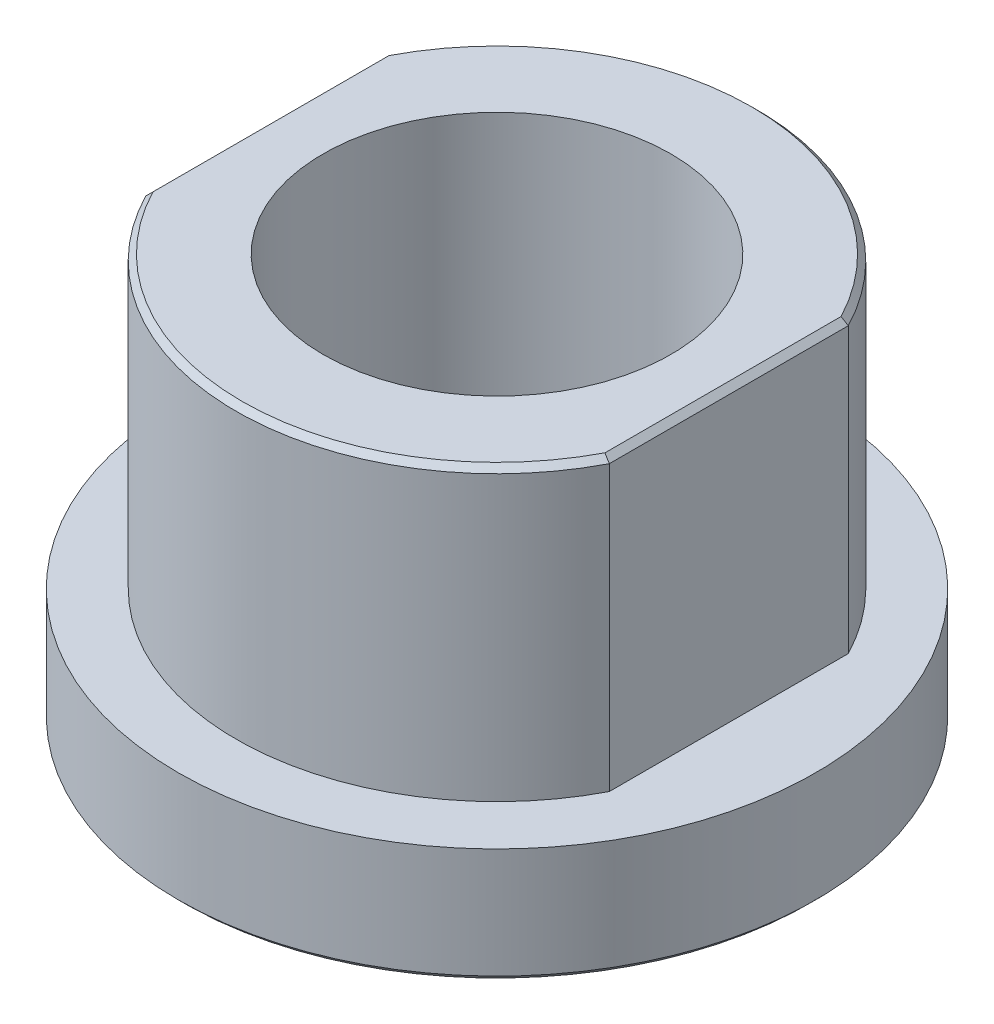
ISO-10303-21;
HEADER;
FILE_DESCRIPTION(('STEP AP214'),'2;1');
FILE_NAME('part.step','',(''),(''),'','','');
FILE_SCHEMA(('AUTOMOTIVE_DESIGN { 1 0 10303 214 1 1 1 1 }'));
ENDSEC;
DATA;
#1=APPLICATION_CONTEXT('core data for automotive mechanical design processes');
#2=APPLICATION_PROTOCOL_DEFINITION('international standard','automotive_design',2000,#1);
#3=PRODUCT_CONTEXT('',#1,'mechanical');
#4=PRODUCT('Part','Part','',(#3));
#5=PRODUCT_RELATED_PRODUCT_CATEGORY('part','',(#4));
#6=PRODUCT_DEFINITION_FORMATION('','',#4);
#7=PRODUCT_DEFINITION_CONTEXT('part definition',#1,'design');
#8=PRODUCT_DEFINITION('design','',#6,#7);
#9=PRODUCT_DEFINITION_SHAPE('','',#8);
#10=(LENGTH_UNIT() NAMED_UNIT(*) SI_UNIT(.MILLI.,.METRE.));
#11=(NAMED_UNIT(*) PLANE_ANGLE_UNIT() SI_UNIT($,.RADIAN.));
#12=(NAMED_UNIT(*) SI_UNIT($,.STERADIAN.) SOLID_ANGLE_UNIT());
#13=UNCERTAINTY_MEASURE_WITH_UNIT(LENGTH_MEASURE(1.E-05),#10,'distance_accuracy_value','');
#14=(GEOMETRIC_REPRESENTATION_CONTEXT(3) GLOBAL_UNCERTAINTY_ASSIGNED_CONTEXT((#13)) GLOBAL_UNIT_ASSIGNED_CONTEXT((#10,
#11,#12)) REPRESENTATION_CONTEXT('',''));
#15=CARTESIAN_POINT('',(0.,0.,0.));
#16=DIRECTION('',(0.,0.,1.));
#17=DIRECTION('',(1.,0.,0.));
#18=AXIS2_PLACEMENT_3D('',#15,#16,#17);
#19=CARTESIAN_POINT('',(0.,0.,0.));
#20=DIRECTION('',(0.,-1.,0.));
#21=DIRECTION('',(0.,0.,-1.));
#22=AXIS2_PLACEMENT_3D('',#19,#20,#21);
#23=CYLINDRICAL_SURFACE('',#22,4.5);
#24=DIRECTION('',(0.,1.,0.));
#25=VECTOR('',#24,1.);
#26=CARTESIAN_POINT('',(4.,-2.15331193145903,2.06155281280883));
#27=LINE('',#26,#25);
#28=CARTESIAN_POINT('',(4.,2.,2.06155281280883));
#29=VERTEX_POINT('',#28);
#30=CARTESIAN_POINT('',(4.,6.9,2.06155281280883));
#31=VERTEX_POINT('',#30);
#32=EDGE_CURVE('E276',#29,#31,#27,.T.);
#33=ORIENTED_EDGE('',*,*,#32,.T.);
#34=CARTESIAN_POINT('',(0.,6.9,0.));
#35=DIRECTION('',(0.,1.,0.));
#36=DIRECTION('',(0.,0.,1.));
#37=AXIS2_PLACEMENT_3D('',#34,#35,#36);
#38=CIRCLE('',#37,4.5);
#39=CARTESIAN_POINT('',(-4.,6.9,2.06155281280883));
#40=VERTEX_POINT('',#39);
#41=EDGE_CURVE('E11',#31,#40,#38,.F.);
#42=ORIENTED_EDGE('',*,*,#41,.T.);
#43=DIRECTION('',(0.,1.,0.));
#44=VECTOR('',#43,1.);
#45=CARTESIAN_POINT('',(-4.,-2.15331193145903,2.06155281280883));
#46=LINE('',#45,#44);
#47=CARTESIAN_POINT('',(-4.,2.,2.06155281280883));
#48=VERTEX_POINT('',#47);
#49=EDGE_CURVE('E118',#48,#40,#46,.T.);
#50=ORIENTED_EDGE('',*,*,#49,.F.);
#51=CARTESIAN_POINT('',(0.,2.,0.));
#52=DIRECTION('',(0.,-1.,0.));
#53=DIRECTION('',(0.,0.,-1.));
#54=AXIS2_PLACEMENT_3D('',#51,#52,#53);
#55=CIRCLE('',#54,4.5);
#56=EDGE_CURVE('E128',#29,#48,#55,.T.);
#57=ORIENTED_EDGE('',*,*,#56,.F.);
#58=EDGE_LOOP('',(#33,#42,#50,#57));
#59=FACE_BOUND('',#58,.T.);
#60=ADVANCED_FACE('F47',(#59),#23,.T.);
#61=CARTESIAN_POINT('',(0.,0.,0.));
#62=DIRECTION('',(0.,-1.,0.));
#63=DIRECTION('',(0.,0.,-1.));
#64=AXIS2_PLACEMENT_3D('',#61,#62,#63);
#65=CYLINDRICAL_SURFACE('',#64,3.);
#66=CARTESIAN_POINT('',(0.,0.,0.));
#67=DIRECTION('',(0.,-1.,0.));
#68=DIRECTION('',(0.,0.,-1.));
#69=AXIS2_PLACEMENT_3D('',#66,#67,#68);
#70=CIRCLE('',#69,3.);
#71=CARTESIAN_POINT('',(0.,0.,-3.));
#72=VERTEX_POINT('',#71);
#73=EDGE_CURVE('E147',#72,#72,#70,.T.);
#74=ORIENTED_EDGE('',*,*,#73,.T.);
#75=EDGE_LOOP('',(#74));
#76=FACE_BOUND('',#75,.T.);
#77=CARTESIAN_POINT('',(0.,7.,0.));
#78=DIRECTION('',(0.,-1.,0.));
#79=DIRECTION('',(0.,0.,-1.));
#80=AXIS2_PLACEMENT_3D('',#77,#78,#79);
#81=CIRCLE('',#80,3.);
#82=CARTESIAN_POINT('',(0.,7.,-3.));
#83=VERTEX_POINT('',#82);
#84=EDGE_CURVE('E130',#83,#83,#81,.T.);
#85=ORIENTED_EDGE('',*,*,#84,.F.);
#86=EDGE_LOOP('',(#85));
#87=FACE_BOUND('',#86,.T.);
#88=ADVANCED_FACE('F222',(#76,#87),#65,.F.);
#89=CARTESIAN_POINT('',(3.,0.,0.));
#90=DIRECTION('',(0.,-1.,0.));
#91=DIRECTION('',(0.,0.,-1.));
#92=AXIS2_PLACEMENT_3D('',#89,#90,#91);
#93=PLANE('',#92);
#94=CARTESIAN_POINT('',(0.,0.,0.));
#95=DIRECTION('',(0.,-1.,0.));
#96=DIRECTION('',(0.,0.,-1.));
#97=AXIS2_PLACEMENT_3D('',#94,#95,#96);
#98=CIRCLE('',#97,5.4);
#99=CARTESIAN_POINT('',(0.,0.,-5.4));
#100=VERTEX_POINT('',#99);
#101=EDGE_CURVE('E151',#100,#100,#98,.T.);
#102=ORIENTED_EDGE('',*,*,#101,.T.);
#103=EDGE_LOOP('',(#102));
#104=FACE_BOUND('',#103,.T.);
#105=ORIENTED_EDGE('',*,*,#73,.F.);
#106=EDGE_LOOP('',(#105));
#107=FACE_BOUND('',#106,.T.);
#108=ADVANCED_FACE('F229',(#104,#107),#93,.T.);
#109=CARTESIAN_POINT('',(0.,0.,0.));
#110=DIRECTION('',(0.,-1.,0.));
#111=DIRECTION('',(0.,0.,-1.));
#112=AXIS2_PLACEMENT_3D('',#109,#110,#111);
#113=CYLINDRICAL_SURFACE('',#112,5.5);
#114=CARTESIAN_POINT('',(0.,0.0999999999999959,0.));
#115=DIRECTION('',(0.,-1.,0.));
#116=DIRECTION('',(0.,0.,-1.));
#117=AXIS2_PLACEMENT_3D('',#114,#115,#116);
#118=CIRCLE('',#117,5.5);
#119=CARTESIAN_POINT('',(0.,0.0999999999999959,-5.5));
#120=VERTEX_POINT('',#119);
#121=EDGE_CURVE('E155',#120,#120,#118,.F.);
#122=ORIENTED_EDGE('',*,*,#121,.T.);
#123=EDGE_LOOP('',(#122));
#124=FACE_BOUND('',#123,.T.);
#125=CARTESIAN_POINT('',(0.,2.,0.));
#126=DIRECTION('',(0.,-1.,0.));
#127=DIRECTION('',(0.,0.,-1.));
#128=AXIS2_PLACEMENT_3D('',#125,#126,#127);
#129=CIRCLE('',#128,5.5);
#130=CARTESIAN_POINT('',(0.,2.,-5.5));
#131=VERTEX_POINT('',#130);
#132=EDGE_CURVE('E139',#131,#131,#129,.T.);
#133=ORIENTED_EDGE('',*,*,#132,.T.);
#134=EDGE_LOOP('',(#133));
#135=FACE_BOUND('',#134,.T.);
#136=ADVANCED_FACE('F242',(#124,#135),#113,.T.);
#137=CARTESIAN_POINT('',(5.5,2.,0.));
#138=DIRECTION('',(0.,1.,0.));
#139=DIRECTION('',(0.,0.,1.));
#140=AXIS2_PLACEMENT_3D('',#137,#138,#139);
#141=PLANE('',#140);
#142=CARTESIAN_POINT('',(-4.,2.,-2.06155281280883));
#143=VERTEX_POINT('',#142);
#144=CARTESIAN_POINT('',(4.,2.,-2.06155281280883));
#145=VERTEX_POINT('',#144);
#146=EDGE_CURVE('E126',#143,#145,#55,.T.);
#147=ORIENTED_EDGE('',*,*,#146,.T.);
#148=DIRECTION('',(0.,0.,-1.));
#149=VECTOR('',#148,1.);
#150=CARTESIAN_POINT('',(4.,2.,-2.06155281280883));
#151=LINE('',#150,#149);
#152=EDGE_CURVE('E274',#29,#145,#151,.T.);
#153=ORIENTED_EDGE('',*,*,#152,.F.);
#154=ORIENTED_EDGE('',*,*,#56,.T.);
#155=DIRECTION('',(0.,0.,1.));
#156=VECTOR('',#155,1.);
#157=CARTESIAN_POINT('',(-4.,2.,-2.06155281280883));
#158=LINE('',#157,#156);
#159=EDGE_CURVE('E111',#143,#48,#158,.T.);
#160=ORIENTED_EDGE('',*,*,#159,.F.);
#161=EDGE_LOOP('',(#147,#153,#154,#160));
#162=FACE_BOUND('',#161,.T.);
#163=ORIENTED_EDGE('',*,*,#132,.F.);
#164=EDGE_LOOP('',(#163));
#165=FACE_BOUND('',#164,.T.);
#166=ADVANCED_FACE('F123',(#162,#165),#141,.T.);
#167=DIRECTION('',(0.,1.,0.));
#168=VECTOR('',#167,1.);
#169=CARTESIAN_POINT('',(-4.,-2.15331193145903,-2.06155281280883));
#170=LINE('',#169,#168);
#171=CARTESIAN_POINT('',(-4.,6.9,-2.06155281280883));
#172=VERTEX_POINT('',#171);
#173=EDGE_CURVE('E108',#143,#172,#170,.T.);
#174=ORIENTED_EDGE('',*,*,#173,.T.);
#175=CARTESIAN_POINT('',(0.,6.9,0.));
#176=DIRECTION('',(0.,1.,0.));
#177=DIRECTION('',(0.,0.,1.));
#178=AXIS2_PLACEMENT_3D('',#175,#176,#177);
#179=CIRCLE('',#178,4.5);
#180=CARTESIAN_POINT('',(4.,6.9,-2.06155281280883));
#181=VERTEX_POINT('',#180);
#182=EDGE_CURVE('E159',#172,#181,#179,.F.);
#183=ORIENTED_EDGE('',*,*,#182,.T.);
#184=DIRECTION('',(0.,1.,0.));
#185=VECTOR('',#184,1.);
#186=CARTESIAN_POINT('',(4.,-2.15331193145903,-2.06155281280883));
#187=LINE('',#186,#185);
#188=EDGE_CURVE('E134',#145,#181,#187,.T.);
#189=ORIENTED_EDGE('',*,*,#188,.F.);
#190=ORIENTED_EDGE('',*,*,#146,.F.);
#191=EDGE_LOOP('',(#174,#183,#189,#190));
#192=FACE_BOUND('',#191,.T.);
#193=ADVANCED_FACE('F133',(#192),#23,.T.);
#194=CARTESIAN_POINT('',(4.5,7.,0.));
#195=DIRECTION('',(0.,1.,0.));
#196=DIRECTION('',(0.,0.,1.));
#197=AXIS2_PLACEMENT_3D('',#194,#195,#196);
#198=PLANE('',#197);
#199=DIRECTION('',(0.,0.,-1.));
#200=VECTOR('',#199,1.);
#201=CARTESIAN_POINT('',(3.9,7.,-2.06155281280883));
#202=LINE('',#201,#200);
#203=CARTESIAN_POINT('',(3.9,7.,2.03715487874633));
#204=VERTEX_POINT('',#203);
#205=CARTESIAN_POINT('',(3.9,7.,-2.03715487874633));
#206=VERTEX_POINT('',#205);
#207=EDGE_CURVE('E168',#204,#206,#202,.T.);
#208=ORIENTED_EDGE('',*,*,#207,.T.);
#209=CARTESIAN_POINT('',(0.,7.,0.));
#210=DIRECTION('',(0.,1.,0.));
#211=DIRECTION('',(0.,0.,1.));
#212=AXIS2_PLACEMENT_3D('',#209,#210,#211);
#213=CIRCLE('',#212,4.4);
#214=CARTESIAN_POINT('',(-3.9,7.,-2.03715487874633));
#215=VERTEX_POINT('',#214);
#216=EDGE_CURVE('E171',#206,#215,#213,.T.);
#217=ORIENTED_EDGE('',*,*,#216,.T.);
#218=DIRECTION('',(0.,0.,1.));
#219=VECTOR('',#218,1.);
#220=CARTESIAN_POINT('',(-3.9,7.,2.06155281280883));
#221=LINE('',#220,#219);
#222=CARTESIAN_POINT('',(-3.9,7.,2.03715487874633));
#223=VERTEX_POINT('',#222);
#224=EDGE_CURVE('E165',#215,#223,#221,.T.);
#225=ORIENTED_EDGE('',*,*,#224,.T.);
#226=CARTESIAN_POINT('',(0.,7.,0.));
#227=DIRECTION('',(0.,1.,0.));
#228=DIRECTION('',(0.,0.,1.));
#229=AXIS2_PLACEMENT_3D('',#226,#227,#228);
#230=CIRCLE('',#229,4.4);
#231=EDGE_CURVE('E162',#223,#204,#230,.T.);
#232=ORIENTED_EDGE('',*,*,#231,.T.);
#233=EDGE_LOOP('',(#208,#217,#225,#232));
#234=FACE_BOUND('',#233,.T.);
#235=ORIENTED_EDGE('',*,*,#84,.T.);
#236=EDGE_LOOP('',(#235));
#237=FACE_BOUND('',#236,.T.);
#238=ADVANCED_FACE('F235',(#234,#237),#198,.T.);
#239=CARTESIAN_POINT('',(4.,-2.15331193145903,-2.06155281280883));
#240=DIRECTION('',(-1.,0.,0.));
#241=DIRECTION('',(0.,0.,1.));
#242=AXIS2_PLACEMENT_3D('',#239,#240,#241);
#243=PLANE('',#242);
#244=ORIENTED_EDGE('',*,*,#188,.T.);
#245=DIRECTION('',(0.,0.,1.));
#246=VECTOR('',#245,1.);
#247=CARTESIAN_POINT('',(4.,6.9,2.06155281280883));
#248=LINE('',#247,#246);
#249=EDGE_CURVE('E77',#181,#31,#248,.T.);
#250=ORIENTED_EDGE('',*,*,#249,.T.);
#251=ORIENTED_EDGE('',*,*,#32,.F.);
#252=ORIENTED_EDGE('',*,*,#152,.T.);
#253=EDGE_LOOP('',(#244,#250,#251,#252));
#254=FACE_BOUND('',#253,.T.);
#255=ADVANCED_FACE('F240',(#254),#243,.F.);
#256=CARTESIAN_POINT('',(-4.,-2.15331193145903,-2.06155281280883));
#257=DIRECTION('',(1.,0.,0.));
#258=DIRECTION('',(0.,0.,-1.));
#259=AXIS2_PLACEMENT_3D('',#256,#257,#258);
#260=PLANE('',#259);
#261=ORIENTED_EDGE('',*,*,#49,.T.);
#262=DIRECTION('',(0.,0.,-1.));
#263=VECTOR('',#262,1.);
#264=CARTESIAN_POINT('',(-4.,6.9,-2.06155281280883));
#265=LINE('',#264,#263);
#266=EDGE_CURVE('E63',#40,#172,#265,.T.);
#267=ORIENTED_EDGE('',*,*,#266,.T.);
#268=ORIENTED_EDGE('',*,*,#173,.F.);
#269=ORIENTED_EDGE('',*,*,#159,.T.);
#270=EDGE_LOOP('',(#261,#267,#268,#269));
#271=FACE_BOUND('',#270,.T.);
#272=ADVANCED_FACE('F110',(#271),#260,.F.);
#273=CARTESIAN_POINT('',(0.,0.,0.));
#274=DIRECTION('',(0.,1.,0.));
#275=DIRECTION('',(0.,0.,1.));
#276=AXIS2_PLACEMENT_3D('',#273,#274,#275);
#277=CONICAL_SURFACE('',#276,5.4,0.785398163397466);
#278=ORIENTED_EDGE('',*,*,#121,.F.);
#279=EDGE_LOOP('',(#278));
#280=FACE_BOUND('',#279,.T.);
#281=ORIENTED_EDGE('',*,*,#101,.F.);
#282=EDGE_LOOP('',(#281));
#283=FACE_BOUND('',#282,.T.);
#284=ADVANCED_FACE('F218',(#280,#283),#277,.T.);
#285=CARTESIAN_POINT('',(0.,6.9,0.));
#286=DIRECTION('',(0.,-1.,0.));
#287=DIRECTION('',(0.,0.,-1.));
#288=AXIS2_PLACEMENT_3D('',#285,#286,#287);
#289=CONICAL_SURFACE('',#288,4.5,0.78539816339744);
#290=CARTESIAN_POINT('',(4.,6.9,2.06155281280883));
#291=CARTESIAN_POINT('',(3.98333046594673,6.91666953405327,2.05750999601715));
#292=CARTESIAN_POINT('',(3.96666236561004,6.93333763438996,2.05345542645514));
#293=CARTESIAN_POINT('',(3.93332903227669,6.96667096772331,2.04532278176778));
#294=CARTESIAN_POINT('',(3.91666379928005,6.98333620071995,2.04124470664228));
#295=CARTESIAN_POINT('',(3.9,7.,2.03715487874633));
#296=B_SPLINE_CURVE_WITH_KNOTS('',3,(#290,#291,#292,#293,#294,#295),.UNSPECIFIED.,.F.,.F.,(4,2,
4),(0.,0.0717552510134997,0.143510502427912),.UNSPECIFIED.);
#297=EDGE_CURVE('E284',#204,#31,#296,.F.);
#298=ORIENTED_EDGE('',*,*,#297,.F.);
#299=ORIENTED_EDGE('',*,*,#231,.F.);
#300=CARTESIAN_POINT('',(-3.9,7.,2.03715487874633));
#301=CARTESIAN_POINT('',(-3.91666379928005,6.98333620071995,2.04124470664228));
#302=CARTESIAN_POINT('',(-3.93332903227669,6.96667096772331,2.04532278176778));
#303=CARTESIAN_POINT('',(-3.96666236561004,6.93333763438996,2.05345542645514));
#304=CARTESIAN_POINT('',(-3.98333046594673,6.91666953405327,2.05750999601715));
#305=CARTESIAN_POINT('',(-4.,6.9,2.06155281280883));
#306=B_SPLINE_CURVE_WITH_KNOTS('',3,(#300,#301,#302,#303,#304,#305),.UNSPECIFIED.,.F.,.F.,(4,2,
4),(0.,0.0717552514144115,0.143510502427911),.UNSPECIFIED.);
#307=EDGE_CURVE('E53',#40,#223,#306,.F.);
#308=ORIENTED_EDGE('',*,*,#307,.F.);
#309=ORIENTED_EDGE('',*,*,#41,.F.);
#310=EDGE_LOOP('',(#298,#299,#308,#309));
#311=FACE_BOUND('',#310,.T.);
#312=ADVANCED_FACE('F50',(#311),#289,.T.);
#313=CARTESIAN_POINT('',(-4.,6.9,-2.06155281280883));
#314=DIRECTION('',(-0.707106781186557,0.707106781186538,0.));
#315=DIRECTION('',(0.,0.,1.));
#316=AXIS2_PLACEMENT_3D('',#313,#314,#315);
#317=PLANE('',#316);
#318=ORIENTED_EDGE('',*,*,#307,.T.);
#319=ORIENTED_EDGE('',*,*,#224,.F.);
#320=CARTESIAN_POINT('',(-3.9,7.,-2.03715487874633));
#321=CARTESIAN_POINT('',(-3.91666379928005,6.98333620071995,-2.04124470664228));
#322=CARTESIAN_POINT('',(-3.93332903227669,6.96667096772331,-2.04532278176778));
#323=CARTESIAN_POINT('',(-3.96666236561004,6.93333763438996,-2.05345542645514));
#324=CARTESIAN_POINT('',(-3.98333046594673,6.91666953405327,-2.05750999601715));
#325=CARTESIAN_POINT('',(-4.,6.9,-2.06155281280883));
#326=B_SPLINE_CURVE_WITH_KNOTS('',3,(#320,#321,#322,#323,#324,#325),.UNSPECIFIED.,.F.,.F.,(4,2,
4),(0.,0.0717552514144115,0.143510502427911),.UNSPECIFIED.);
#327=EDGE_CURVE('E188',#172,#215,#326,.F.);
#328=ORIENTED_EDGE('',*,*,#327,.F.);
#329=ORIENTED_EDGE('',*,*,#266,.F.);
#330=EDGE_LOOP('',(#318,#319,#328,#329));
#331=FACE_BOUND('',#330,.T.);
#332=ADVANCED_FACE('F205',(#331),#317,.T.);
#333=CARTESIAN_POINT('',(4.,6.9,-2.06155281280883));
#334=DIRECTION('',(0.707106781186557,0.707106781186538,0.));
#335=DIRECTION('',(0.,0.,-1.));
#336=AXIS2_PLACEMENT_3D('',#333,#334,#335);
#337=PLANE('',#336);
#338=ORIENTED_EDGE('',*,*,#297,.T.);
#339=ORIENTED_EDGE('',*,*,#249,.F.);
#340=CARTESIAN_POINT('',(4.,6.9,-2.06155281280883));
#341=CARTESIAN_POINT('',(3.98333046594673,6.91666953405327,-2.05750999601715));
#342=CARTESIAN_POINT('',(3.96666236561004,6.93333763438996,-2.05345542645514));
#343=CARTESIAN_POINT('',(3.93332903227669,6.96667096772331,-2.04532278176778));
#344=CARTESIAN_POINT('',(3.91666379928005,6.98333620071995,-2.04124470664228));
#345=CARTESIAN_POINT('',(3.9,7.,-2.03715487874633));
#346=B_SPLINE_CURVE_WITH_KNOTS('',3,(#340,#341,#342,#343,#344,#345),.UNSPECIFIED.,.F.,.F.,(4,2,
4),(0.,0.0717552510134997,0.143510502427912),.UNSPECIFIED.);
#347=EDGE_CURVE('E179',#206,#181,#346,.F.);
#348=ORIENTED_EDGE('',*,*,#347,.F.);
#349=ORIENTED_EDGE('',*,*,#207,.F.);
#350=EDGE_LOOP('',(#338,#339,#348,#349));
#351=FACE_BOUND('',#350,.T.);
#352=ADVANCED_FACE('F194',(#351),#337,.T.);
#353=CARTESIAN_POINT('',(0.,6.9,0.));
#354=DIRECTION('',(0.,-1.,0.));
#355=DIRECTION('',(0.,0.,-1.));
#356=AXIS2_PLACEMENT_3D('',#353,#354,#355);
#357=CONICAL_SURFACE('',#356,4.5,0.78539816339744);
#358=ORIENTED_EDGE('',*,*,#327,.T.);
#359=ORIENTED_EDGE('',*,*,#216,.F.);
#360=ORIENTED_EDGE('',*,*,#347,.T.);
#361=ORIENTED_EDGE('',*,*,#182,.F.);
#362=EDGE_LOOP('',(#358,#359,#360,#361));
#363=FACE_BOUND('',#362,.T.);
#364=ADVANCED_FACE('F198',(#363),#357,.T.);
#365=CLOSED_SHELL('',(#60,#88,#108,#136,#166,#193,#238,#255,#272,#284,#312,#332,#352,#364));
#366=MANIFOLD_SOLID_BREP('B2',#365);
#367=ADVANCED_BREP_SHAPE_REPRESENTATION('',(#18,#366),#14);
#368=SHAPE_DEFINITION_REPRESENTATION(#9,#367);
ENDSEC;
END-ISO-10303-21;
